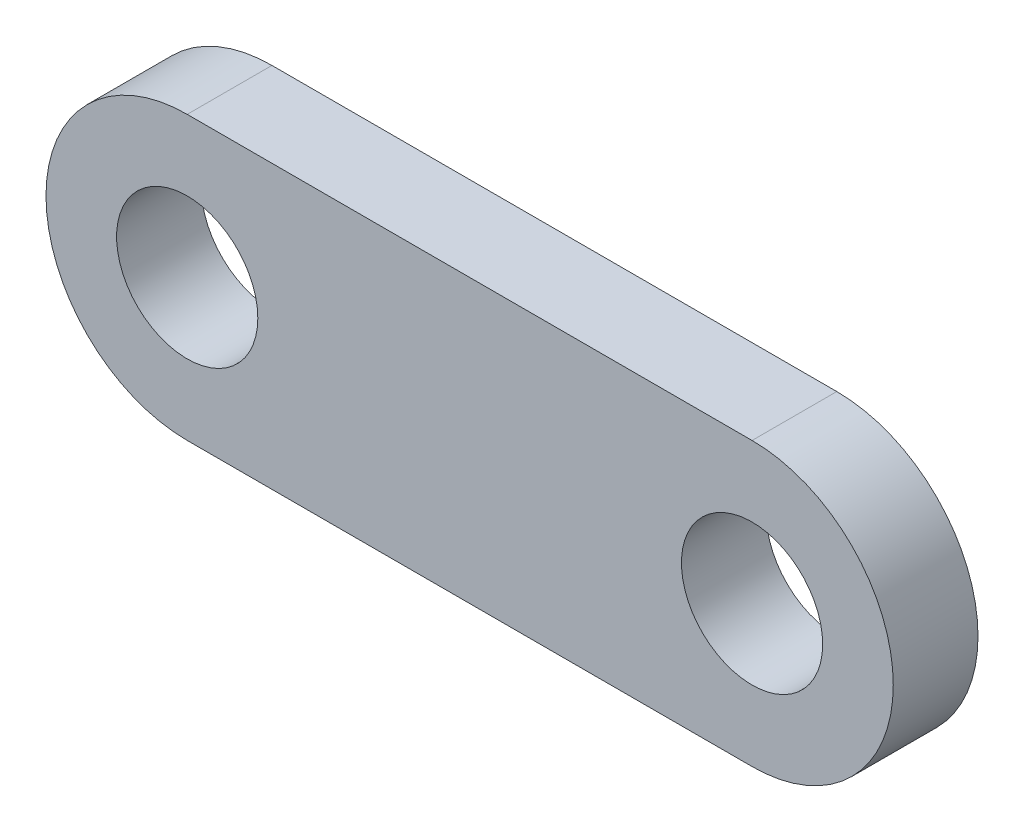
ISO-10303-21;
HEADER;
FILE_DESCRIPTION(('STEP AP214'),'2;1');
FILE_NAME('part.step','',(''),(''),'','','');
FILE_SCHEMA(('AUTOMOTIVE_DESIGN { 1 0 10303 214 1 1 1 1 }'));
ENDSEC;
DATA;
#1=APPLICATION_CONTEXT('core data for automotive mechanical design processes');
#2=APPLICATION_PROTOCOL_DEFINITION('international standard','automotive_design',2000,#1);
#3=PRODUCT_CONTEXT('',#1,'mechanical');
#4=PRODUCT('Part','Part','',(#3));
#5=PRODUCT_RELATED_PRODUCT_CATEGORY('part','',(#4));
#6=PRODUCT_DEFINITION_FORMATION('','',#4);
#7=PRODUCT_DEFINITION_CONTEXT('part definition',#1,'design');
#8=PRODUCT_DEFINITION('design','',#6,#7);
#9=PRODUCT_DEFINITION_SHAPE('','',#8);
#10=(LENGTH_UNIT() NAMED_UNIT(*) SI_UNIT(.MILLI.,.METRE.));
#11=(NAMED_UNIT(*) PLANE_ANGLE_UNIT() SI_UNIT($,.RADIAN.));
#12=(NAMED_UNIT(*) SI_UNIT($,.STERADIAN.) SOLID_ANGLE_UNIT());
#13=UNCERTAINTY_MEASURE_WITH_UNIT(LENGTH_MEASURE(1.E-05),#10,'distance_accuracy_value','');
#14=(GEOMETRIC_REPRESENTATION_CONTEXT(3) GLOBAL_UNCERTAINTY_ASSIGNED_CONTEXT((#13)) GLOBAL_UNIT_ASSIGNED_CONTEXT((#10,
#11,#12)) REPRESENTATION_CONTEXT('',''));
#15=CARTESIAN_POINT('',(0.,0.,0.));
#16=DIRECTION('',(0.,0.,1.));
#17=DIRECTION('',(1.,0.,0.));
#18=AXIS2_PLACEMENT_3D('',#15,#16,#17);
#19=CARTESIAN_POINT('',(0.,0.,3.));
#20=DIRECTION('',(0.,0.,1.));
#21=DIRECTION('',(1.,0.,0.));
#22=AXIS2_PLACEMENT_3D('',#19,#20,#21);
#23=PLANE('',#22);
#24=CARTESIAN_POINT('',(-20.,0.,3.));
#25=DIRECTION('',(0.,0.,1.));
#26=DIRECTION('',(1.,0.,0.));
#27=AXIS2_PLACEMENT_3D('',#24,#25,#26);
#28=CIRCLE('',#27,2.5);
#29=CARTESIAN_POINT('',(-17.5,0.,3.));
#30=VERTEX_POINT('',#29);
#31=EDGE_CURVE('E112',#30,#30,#28,.T.);
#32=ORIENTED_EDGE('',*,*,#31,.F.);
#33=EDGE_LOOP('',(#32));
#34=FACE_BOUND('',#33,.T.);
#35=CARTESIAN_POINT('',(0.,0.,3.));
#36=DIRECTION('',(0.,0.,1.));
#37=DIRECTION('',(1.,0.,0.));
#38=AXIS2_PLACEMENT_3D('',#35,#36,#37);
#39=CIRCLE('',#38,5.);
#40=CARTESIAN_POINT('',(0.,-5.,3.));
#41=VERTEX_POINT('',#40);
#42=CARTESIAN_POINT('',(0.,5.,3.));
#43=VERTEX_POINT('',#42);
#44=EDGE_CURVE('E92',#41,#43,#39,.T.);
#45=ORIENTED_EDGE('',*,*,#44,.T.);
#46=DIRECTION('',(-1.,0.,0.));
#47=VECTOR('',#46,1.);
#48=CARTESIAN_POINT('',(0.,5.,3.));
#49=LINE('',#48,#47);
#50=CARTESIAN_POINT('',(-20.,5.,3.));
#51=VERTEX_POINT('',#50);
#52=EDGE_CURVE('E87',#43,#51,#49,.T.);
#53=ORIENTED_EDGE('',*,*,#52,.T.);
#54=CARTESIAN_POINT('',(-20.,0.,3.));
#55=DIRECTION('',(0.,0.,1.));
#56=DIRECTION('',(1.,0.,0.));
#57=AXIS2_PLACEMENT_3D('',#54,#55,#56);
#58=CIRCLE('',#57,5.);
#59=CARTESIAN_POINT('',(-20.,-5.,3.));
#60=VERTEX_POINT('',#59);
#61=EDGE_CURVE('E90',#51,#60,#58,.T.);
#62=ORIENTED_EDGE('',*,*,#61,.T.);
#63=DIRECTION('',(1.,0.,0.));
#64=VECTOR('',#63,1.);
#65=CARTESIAN_POINT('',(0.,-5.,3.));
#66=LINE('',#65,#64);
#67=EDGE_CURVE('E57',#60,#41,#66,.T.);
#68=ORIENTED_EDGE('',*,*,#67,.T.);
#69=EDGE_LOOP('',(#45,#53,#62,#68));
#70=FACE_BOUND('',#69,.T.);
#71=CARTESIAN_POINT('',(0.,0.,3.));
#72=DIRECTION('',(0.,0.,1.));
#73=DIRECTION('',(1.,0.,0.));
#74=AXIS2_PLACEMENT_3D('',#71,#72,#73);
#75=CIRCLE('',#74,2.5);
#76=CARTESIAN_POINT('',(2.5,0.,3.));
#77=VERTEX_POINT('',#76);
#78=EDGE_CURVE('E134',#77,#77,#75,.T.);
#79=ORIENTED_EDGE('',*,*,#78,.F.);
#80=EDGE_LOOP('',(#79));
#81=FACE_BOUND('',#80,.T.);
#82=ADVANCED_FACE('F39',(#34,#70,#81),#23,.T.);
#83=CARTESIAN_POINT('',(0.,0.,0.));
#84=DIRECTION('',(0.,0.,1.));
#85=DIRECTION('',(1.,0.,0.));
#86=AXIS2_PLACEMENT_3D('',#83,#84,#85);
#87=PLANE('',#86);
#88=CARTESIAN_POINT('',(0.,0.,0.));
#89=DIRECTION('',(0.,0.,1.));
#90=DIRECTION('',(1.,0.,0.));
#91=AXIS2_PLACEMENT_3D('',#88,#89,#90);
#92=CIRCLE('',#91,5.);
#93=CARTESIAN_POINT('',(0.,-5.,0.));
#94=VERTEX_POINT('',#93);
#95=CARTESIAN_POINT('',(0.,5.,0.));
#96=VERTEX_POINT('',#95);
#97=EDGE_CURVE('E108',#94,#96,#92,.T.);
#98=ORIENTED_EDGE('',*,*,#97,.F.);
#99=DIRECTION('',(1.,0.,0.));
#100=VECTOR('',#99,1.);
#101=CARTESIAN_POINT('',(0.,-5.,0.));
#102=LINE('',#101,#100);
#103=CARTESIAN_POINT('',(-20.,-5.,0.));
#104=VERTEX_POINT('',#103);
#105=EDGE_CURVE('E80',#104,#94,#102,.T.);
#106=ORIENTED_EDGE('',*,*,#105,.F.);
#107=CARTESIAN_POINT('',(-20.,0.,0.));
#108=DIRECTION('',(0.,0.,1.));
#109=DIRECTION('',(1.,0.,0.));
#110=AXIS2_PLACEMENT_3D('',#107,#108,#109);
#111=CIRCLE('',#110,5.);
#112=CARTESIAN_POINT('',(-20.,5.,0.));
#113=VERTEX_POINT('',#112);
#114=EDGE_CURVE('E74',#113,#104,#111,.T.);
#115=ORIENTED_EDGE('',*,*,#114,.F.);
#116=DIRECTION('',(-1.,0.,0.));
#117=VECTOR('',#116,1.);
#118=CARTESIAN_POINT('',(0.,5.,0.));
#119=LINE('',#118,#117);
#120=EDGE_CURVE('E97',#96,#113,#119,.T.);
#121=ORIENTED_EDGE('',*,*,#120,.F.);
#122=EDGE_LOOP('',(#98,#106,#115,#121));
#123=FACE_BOUND('',#122,.T.);
#124=CARTESIAN_POINT('',(-20.,0.,0.));
#125=DIRECTION('',(0.,0.,1.));
#126=DIRECTION('',(1.,0.,0.));
#127=AXIS2_PLACEMENT_3D('',#124,#125,#126);
#128=CIRCLE('',#127,2.5);
#129=CARTESIAN_POINT('',(-17.5,0.,0.));
#130=VERTEX_POINT('',#129);
#131=EDGE_CURVE('E130',#130,#130,#128,.T.);
#132=ORIENTED_EDGE('',*,*,#131,.T.);
#133=EDGE_LOOP('',(#132));
#134=FACE_BOUND('',#133,.T.);
#135=CARTESIAN_POINT('',(0.,0.,0.));
#136=DIRECTION('',(0.,0.,1.));
#137=DIRECTION('',(1.,0.,0.));
#138=AXIS2_PLACEMENT_3D('',#135,#136,#137);
#139=CIRCLE('',#138,2.5);
#140=CARTESIAN_POINT('',(2.5,0.,0.));
#141=VERTEX_POINT('',#140);
#142=EDGE_CURVE('E138',#141,#141,#139,.T.);
#143=ORIENTED_EDGE('',*,*,#142,.T.);
#144=EDGE_LOOP('',(#143));
#145=FACE_BOUND('',#144,.T.);
#146=ADVANCED_FACE('F125',(#123,#134,#145),#87,.F.);
#147=CARTESIAN_POINT('',(0.,0.,3.));
#148=DIRECTION('',(0.,0.,-1.));
#149=DIRECTION('',(-1.,0.,0.));
#150=AXIS2_PLACEMENT_3D('',#147,#148,#149);
#151=CYLINDRICAL_SURFACE('',#150,5.);
#152=ORIENTED_EDGE('',*,*,#97,.T.);
#153=DIRECTION('',(0.,0.,-1.));
#154=VECTOR('',#153,1.);
#155=CARTESIAN_POINT('',(0.,5.,3.));
#156=LINE('',#155,#154);
#157=EDGE_CURVE('E11',#43,#96,#156,.T.);
#158=ORIENTED_EDGE('',*,*,#157,.F.);
#159=ORIENTED_EDGE('',*,*,#44,.F.);
#160=DIRECTION('',(0.,0.,-1.));
#161=VECTOR('',#160,1.);
#162=CARTESIAN_POINT('',(0.,-5.,3.));
#163=LINE('',#162,#161);
#164=EDGE_CURVE('E104',#41,#94,#163,.T.);
#165=ORIENTED_EDGE('',*,*,#164,.T.);
#166=EDGE_LOOP('',(#152,#158,#159,#165));
#167=FACE_BOUND('',#166,.T.);
#168=ADVANCED_FACE('F41',(#167),#151,.T.);
#169=CARTESIAN_POINT('',(0.,5.,3.));
#170=DIRECTION('',(0.,-1.,0.));
#171=DIRECTION('',(1.,0.,0.));
#172=AXIS2_PLACEMENT_3D('',#169,#170,#171);
#173=PLANE('',#172);
#174=ORIENTED_EDGE('',*,*,#120,.T.);
#175=DIRECTION('',(0.,0.,-1.));
#176=VECTOR('',#175,1.);
#177=CARTESIAN_POINT('',(-20.,5.,3.));
#178=LINE('',#177,#176);
#179=EDGE_CURVE('E49',#51,#113,#178,.T.);
#180=ORIENTED_EDGE('',*,*,#179,.F.);
#181=ORIENTED_EDGE('',*,*,#52,.F.);
#182=ORIENTED_EDGE('',*,*,#157,.T.);
#183=EDGE_LOOP('',(#174,#180,#181,#182));
#184=FACE_BOUND('',#183,.T.);
#185=ADVANCED_FACE('F96',(#184),#173,.F.);
#186=CARTESIAN_POINT('',(-20.,0.,3.));
#187=DIRECTION('',(0.,0.,-1.));
#188=DIRECTION('',(-1.,0.,0.));
#189=AXIS2_PLACEMENT_3D('',#186,#187,#188);
#190=CYLINDRICAL_SURFACE('',#189,5.);
#191=ORIENTED_EDGE('',*,*,#114,.T.);
#192=DIRECTION('',(0.,0.,-1.));
#193=VECTOR('',#192,1.);
#194=CARTESIAN_POINT('',(-20.,-5.,3.));
#195=LINE('',#194,#193);
#196=EDGE_CURVE('E99',#60,#104,#195,.T.);
#197=ORIENTED_EDGE('',*,*,#196,.F.);
#198=ORIENTED_EDGE('',*,*,#61,.F.);
#199=ORIENTED_EDGE('',*,*,#179,.T.);
#200=EDGE_LOOP('',(#191,#197,#198,#199));
#201=FACE_BOUND('',#200,.T.);
#202=ADVANCED_FACE('F100',(#201),#190,.T.);
#203=CARTESIAN_POINT('',(0.,-5.,3.));
#204=DIRECTION('',(0.,1.,0.));
#205=DIRECTION('',(-1.,0.,0.));
#206=AXIS2_PLACEMENT_3D('',#203,#204,#205);
#207=PLANE('',#206);
#208=ORIENTED_EDGE('',*,*,#105,.T.);
#209=ORIENTED_EDGE('',*,*,#164,.F.);
#210=ORIENTED_EDGE('',*,*,#67,.F.);
#211=ORIENTED_EDGE('',*,*,#196,.T.);
#212=EDGE_LOOP('',(#208,#209,#210,#211));
#213=FACE_BOUND('',#212,.T.);
#214=ADVANCED_FACE('F122',(#213),#207,.F.);
#215=CARTESIAN_POINT('',(-20.,0.,3.));
#216=DIRECTION('',(0.,0.,-1.));
#217=DIRECTION('',(-1.,0.,0.));
#218=AXIS2_PLACEMENT_3D('',#215,#216,#217);
#219=CYLINDRICAL_SURFACE('',#218,2.5);
#220=ORIENTED_EDGE('',*,*,#31,.T.);
#221=EDGE_LOOP('',(#220));
#222=FACE_BOUND('',#221,.T.);
#223=ORIENTED_EDGE('',*,*,#131,.F.);
#224=EDGE_LOOP('',(#223));
#225=FACE_BOUND('',#224,.T.);
#226=ADVANCED_FACE('F157',(#222,#225),#219,.F.);
#227=CARTESIAN_POINT('',(0.,0.,3.));
#228=DIRECTION('',(0.,0.,-1.));
#229=DIRECTION('',(-1.,0.,0.));
#230=AXIS2_PLACEMENT_3D('',#227,#228,#229);
#231=CYLINDRICAL_SURFACE('',#230,2.5);
#232=ORIENTED_EDGE('',*,*,#78,.T.);
#233=EDGE_LOOP('',(#232));
#234=FACE_BOUND('',#233,.T.);
#235=ORIENTED_EDGE('',*,*,#142,.F.);
#236=EDGE_LOOP('',(#235));
#237=FACE_BOUND('',#236,.T.);
#238=ADVANCED_FACE('F146',(#234,#237),#231,.F.);
#239=CLOSED_SHELL('',(#82,#146,#168,#185,#202,#214,#226,#238));
#240=MANIFOLD_SOLID_BREP('B2',#239);
#241=ADVANCED_BREP_SHAPE_REPRESENTATION('',(#18,#240),#14);
#242=SHAPE_DEFINITION_REPRESENTATION(#9,#241);
ENDSEC;
END-ISO-10303-21;
